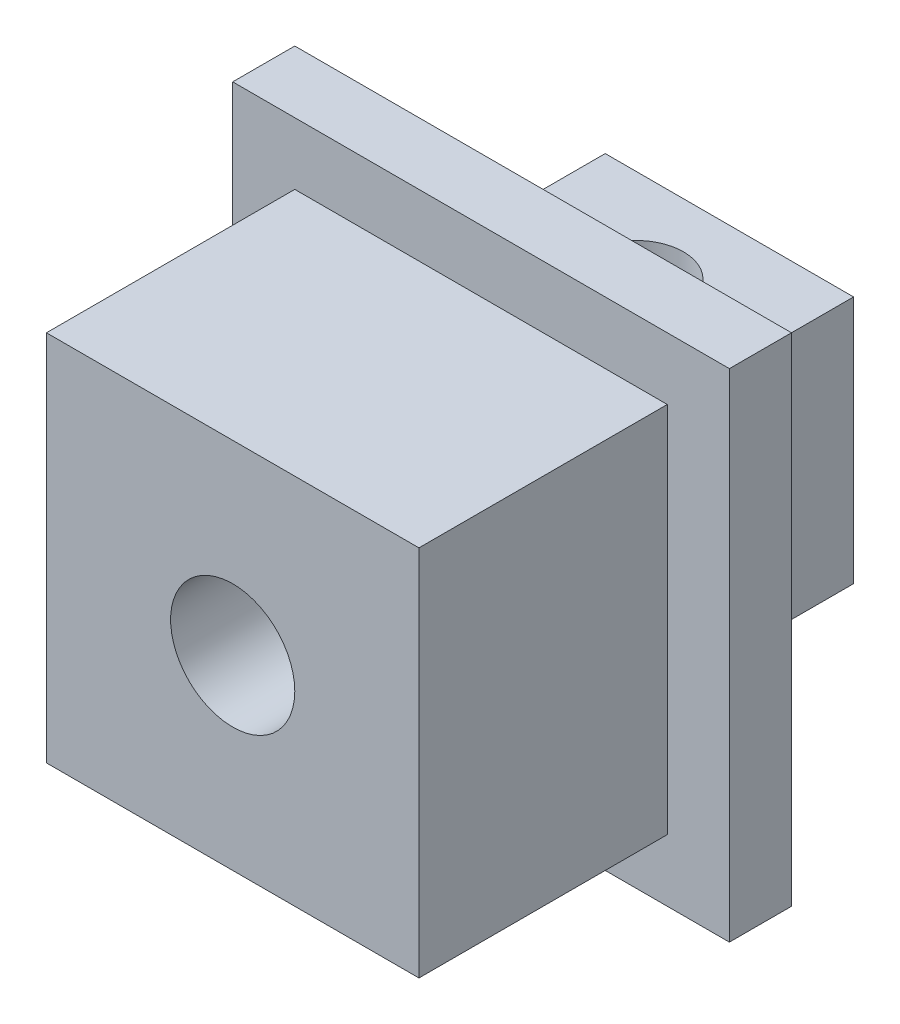
ISO-10303-21;
HEADER;
FILE_DESCRIPTION(('STEP AP214'),'2;1');
FILE_NAME('part.step','',(''),(''),'','','');
FILE_SCHEMA(('AUTOMOTIVE_DESIGN { 1 0 10303 214 1 1 1 1 }'));
ENDSEC;
DATA;
#1=APPLICATION_CONTEXT('core data for automotive mechanical design processes');
#2=APPLICATION_PROTOCOL_DEFINITION('international standard','automotive_design',2000,#1);
#3=PRODUCT_CONTEXT('',#1,'mechanical');
#4=PRODUCT('Part','Part','',(#3));
#5=PRODUCT_RELATED_PRODUCT_CATEGORY('part','',(#4));
#6=PRODUCT_DEFINITION_FORMATION('','',#4);
#7=PRODUCT_DEFINITION_CONTEXT('part definition',#1,'design');
#8=PRODUCT_DEFINITION('design','',#6,#7);
#9=PRODUCT_DEFINITION_SHAPE('','',#8);
#10=(LENGTH_UNIT() NAMED_UNIT(*) SI_UNIT(.MILLI.,.METRE.));
#11=(NAMED_UNIT(*) PLANE_ANGLE_UNIT() SI_UNIT($,.RADIAN.));
#12=(NAMED_UNIT(*) SI_UNIT($,.STERADIAN.) SOLID_ANGLE_UNIT());
#13=UNCERTAINTY_MEASURE_WITH_UNIT(LENGTH_MEASURE(1.E-05),#10,'distance_accuracy_value','');
#14=(GEOMETRIC_REPRESENTATION_CONTEXT(3) GLOBAL_UNCERTAINTY_ASSIGNED_CONTEXT((#13)) GLOBAL_UNIT_ASSIGNED_CONTEXT((#10,
#11,#12)) REPRESENTATION_CONTEXT('',''));
#15=CARTESIAN_POINT('',(0.,0.,0.));
#16=DIRECTION('',(0.,0.,1.));
#17=DIRECTION('',(1.,0.,0.));
#18=AXIS2_PLACEMENT_3D('',#15,#16,#17);
#19=CARTESIAN_POINT('',(0.,0.,-3.175));
#20=DIRECTION('',(0.,0.,-1.));
#21=DIRECTION('',(-1.,0.,0.));
#22=AXIS2_PLACEMENT_3D('',#19,#20,#21);
#23=PLANE('',#22);
#24=DIRECTION('',(0.,1.,0.));
#25=VECTOR('',#24,1.);
#26=CARTESIAN_POINT('',(-3.175,-3.175,-3.175));
#27=LINE('',#26,#25);
#28=CARTESIAN_POINT('',(-3.175,-3.175,-3.175));
#29=VERTEX_POINT('',#28);
#30=CARTESIAN_POINT('',(-3.175,22.225,-3.175));
#31=VERTEX_POINT('',#30);
#32=EDGE_CURVE('E197',#29,#31,#27,.T.);
#33=ORIENTED_EDGE('',*,*,#32,.T.);
#34=DIRECTION('',(1.,0.,0.));
#35=VECTOR('',#34,1.);
#36=CARTESIAN_POINT('',(-3.175,22.225,-3.175));
#37=LINE('',#36,#35);
#38=CARTESIAN_POINT('',(22.225,22.225,-3.175));
#39=VERTEX_POINT('',#38);
#40=EDGE_CURVE('E200',#31,#39,#37,.T.);
#41=ORIENTED_EDGE('',*,*,#40,.T.);
#42=DIRECTION('',(0.,-1.,0.));
#43=VECTOR('',#42,1.);
#44=CARTESIAN_POINT('',(22.225,-3.175,-3.175));
#45=LINE('',#44,#43);
#46=CARTESIAN_POINT('',(22.225,-3.175,-3.175));
#47=VERTEX_POINT('',#46);
#48=EDGE_CURVE('E203',#39,#47,#45,.T.);
#49=ORIENTED_EDGE('',*,*,#48,.T.);
#50=DIRECTION('',(-1.,0.,0.));
#51=VECTOR('',#50,1.);
#52=CARTESIAN_POINT('',(-3.175,-3.175,-3.175));
#53=LINE('',#52,#51);
#54=EDGE_CURVE('E205',#47,#29,#53,.T.);
#55=ORIENTED_EDGE('',*,*,#54,.T.);
#56=EDGE_LOOP('',(#33,#41,#49,#55));
#57=FACE_BOUND('',#56,.T.);
#58=DIRECTION('',(1.,0.,0.));
#59=VECTOR('',#58,1.);
#60=CARTESIAN_POINT('',(3.175,15.875,-3.175));
#61=LINE('',#60,#59);
#62=CARTESIAN_POINT('',(3.175,15.875,-3.175));
#63=VERTEX_POINT('',#62);
#64=CARTESIAN_POINT('',(15.875,15.875,-3.175));
#65=VERTEX_POINT('',#64);
#66=EDGE_CURVE('E410',#63,#65,#61,.T.);
#67=ORIENTED_EDGE('',*,*,#66,.F.);
#68=DIRECTION('',(0.,1.,0.));
#69=VECTOR('',#68,1.);
#70=CARTESIAN_POINT('',(3.175,3.175,-3.175));
#71=LINE('',#70,#69);
#72=CARTESIAN_POINT('',(3.175,3.175,-3.175));
#73=VERTEX_POINT('',#72);
#74=EDGE_CURVE('E187',#73,#63,#71,.T.);
#75=ORIENTED_EDGE('',*,*,#74,.F.);
#76=DIRECTION('',(-1.,0.,0.));
#77=VECTOR('',#76,1.);
#78=CARTESIAN_POINT('',(3.175,3.175,-3.175));
#79=LINE('',#78,#77);
#80=CARTESIAN_POINT('',(15.875,3.175,-3.175));
#81=VERTEX_POINT('',#80);
#82=EDGE_CURVE('E183',#81,#73,#79,.T.);
#83=ORIENTED_EDGE('',*,*,#82,.F.);
#84=DIRECTION('',(0.,-1.,0.));
#85=VECTOR('',#84,1.);
#86=CARTESIAN_POINT('',(15.875,3.175,-3.175));
#87=LINE('',#86,#85);
#88=EDGE_CURVE('E412',#65,#81,#87,.T.);
#89=ORIENTED_EDGE('',*,*,#88,.F.);
#90=EDGE_LOOP('',(#67,#75,#83,#89));
#91=FACE_BOUND('',#90,.T.);
#92=ADVANCED_FACE('F33',(#57,#91),#23,.T.);
#93=CARTESIAN_POINT('',(0.,0.,12.7));
#94=DIRECTION('',(0.,0.,-1.));
#95=DIRECTION('',(-1.,0.,0.));
#96=AXIS2_PLACEMENT_3D('',#93,#94,#95);
#97=PLANE('',#96);
#98=DIRECTION('',(0.,-1.,0.));
#99=VECTOR('',#98,1.);
#100=CARTESIAN_POINT('',(0.,0.,12.7));
#101=LINE('',#100,#99);
#102=CARTESIAN_POINT('',(0.,19.05,12.7));
#103=VERTEX_POINT('',#102);
#104=CARTESIAN_POINT('',(0.,0.,12.7));
#105=VERTEX_POINT('',#104);
#106=EDGE_CURVE('E91',#103,#105,#101,.T.);
#107=ORIENTED_EDGE('',*,*,#106,.T.);
#108=DIRECTION('',(1.,0.,0.));
#109=VECTOR('',#108,1.);
#110=CARTESIAN_POINT('',(0.,0.,12.7));
#111=LINE('',#110,#109);
#112=CARTESIAN_POINT('',(19.05,0.,12.7));
#113=VERTEX_POINT('',#112);
#114=EDGE_CURVE('E83',#105,#113,#111,.T.);
#115=ORIENTED_EDGE('',*,*,#114,.T.);
#116=DIRECTION('',(0.,1.,0.));
#117=VECTOR('',#116,1.);
#118=CARTESIAN_POINT('',(19.05,0.,12.7));
#119=LINE('',#118,#117);
#120=CARTESIAN_POINT('',(19.05,19.05,12.7));
#121=VERTEX_POINT('',#120);
#122=EDGE_CURVE('E88',#113,#121,#119,.T.);
#123=ORIENTED_EDGE('',*,*,#122,.T.);
#124=DIRECTION('',(-1.,0.,0.));
#125=VECTOR('',#124,1.);
#126=CARTESIAN_POINT('',(0.,19.05,12.7));
#127=LINE('',#126,#125);
#128=EDGE_CURVE('E57',#121,#103,#127,.T.);
#129=ORIENTED_EDGE('',*,*,#128,.T.);
#130=EDGE_LOOP('',(#107,#115,#123,#129));
#131=FACE_BOUND('',#130,.T.);
#132=CARTESIAN_POINT('',(9.525,9.525,12.7));
#133=DIRECTION('',(0.,0.,1.));
#134=DIRECTION('',(1.,0.,0.));
#135=AXIS2_PLACEMENT_3D('',#132,#133,#134);
#136=CIRCLE('',#135,3.175);
#137=CARTESIAN_POINT('',(12.7,9.525,12.7));
#138=VERTEX_POINT('',#137);
#139=EDGE_CURVE('E108',#138,#138,#136,.T.);
#140=ORIENTED_EDGE('',*,*,#139,.F.);
#141=EDGE_LOOP('',(#140));
#142=FACE_BOUND('',#141,.T.);
#143=ADVANCED_FACE('F85',(#131,#142),#97,.F.);
#144=CARTESIAN_POINT('',(0.,0.,12.7));
#145=DIRECTION('',(1.,0.,0.));
#146=DIRECTION('',(0.,0.,-1.));
#147=AXIS2_PLACEMENT_3D('',#144,#145,#146);
#148=PLANE('',#147);
#149=DIRECTION('',(0.,-1.,0.));
#150=VECTOR('',#149,1.);
#151=CARTESIAN_POINT('',(0.,0.,0.));
#152=LINE('',#151,#150);
#153=CARTESIAN_POINT('',(0.,19.05,0.));
#154=VERTEX_POINT('',#153);
#155=CARTESIAN_POINT('',(0.,0.,0.));
#156=VERTEX_POINT('',#155);
#157=EDGE_CURVE('E70',#154,#156,#152,.T.);
#158=ORIENTED_EDGE('',*,*,#157,.T.);
#159=DIRECTION('',(0.,0.,-1.));
#160=VECTOR('',#159,1.);
#161=CARTESIAN_POINT('',(0.,0.,12.7));
#162=LINE('',#161,#160);
#163=EDGE_CURVE('E11',#105,#156,#162,.T.);
#164=ORIENTED_EDGE('',*,*,#163,.F.);
#165=ORIENTED_EDGE('',*,*,#106,.F.);
#166=DIRECTION('',(0.,0.,-1.));
#167=VECTOR('',#166,1.);
#168=CARTESIAN_POINT('',(0.,19.05,12.7));
#169=LINE('',#168,#167);
#170=EDGE_CURVE('E103',#103,#154,#169,.T.);
#171=ORIENTED_EDGE('',*,*,#170,.T.);
#172=EDGE_LOOP('',(#158,#164,#165,#171));
#173=FACE_BOUND('',#172,.T.);
#174=ADVANCED_FACE('F35',(#173),#148,.F.);
#175=CARTESIAN_POINT('',(0.,0.,12.7));
#176=DIRECTION('',(0.,1.,0.));
#177=DIRECTION('',(0.,0.,1.));
#178=AXIS2_PLACEMENT_3D('',#175,#176,#177);
#179=PLANE('',#178);
#180=DIRECTION('',(1.,0.,0.));
#181=VECTOR('',#180,1.);
#182=CARTESIAN_POINT('',(0.,0.,0.));
#183=LINE('',#182,#181);
#184=CARTESIAN_POINT('',(19.05,0.,0.));
#185=VERTEX_POINT('',#184);
#186=EDGE_CURVE('E78',#156,#185,#183,.T.);
#187=ORIENTED_EDGE('',*,*,#186,.T.);
#188=DIRECTION('',(0.,0.,-1.));
#189=VECTOR('',#188,1.);
#190=CARTESIAN_POINT('',(19.05,0.,12.7));
#191=LINE('',#190,#189);
#192=EDGE_CURVE('E41',#113,#185,#191,.T.);
#193=ORIENTED_EDGE('',*,*,#192,.F.);
#194=ORIENTED_EDGE('',*,*,#114,.F.);
#195=ORIENTED_EDGE('',*,*,#163,.T.);
#196=EDGE_LOOP('',(#187,#193,#194,#195));
#197=FACE_BOUND('',#196,.T.);
#198=ADVANCED_FACE('F96',(#197),#179,.F.);
#199=CARTESIAN_POINT('',(19.05,0.,12.7));
#200=DIRECTION('',(-1.,0.,0.));
#201=DIRECTION('',(0.,0.,1.));
#202=AXIS2_PLACEMENT_3D('',#199,#200,#201);
#203=PLANE('',#202);
#204=DIRECTION('',(0.,1.,0.));
#205=VECTOR('',#204,1.);
#206=CARTESIAN_POINT('',(19.05,0.,0.));
#207=LINE('',#206,#205);
#208=CARTESIAN_POINT('',(19.05,19.05,0.));
#209=VERTEX_POINT('',#208);
#210=EDGE_CURVE('E110',#185,#209,#207,.T.);
#211=ORIENTED_EDGE('',*,*,#210,.T.);
#212=DIRECTION('',(0.,0.,-1.));
#213=VECTOR('',#212,1.);
#214=CARTESIAN_POINT('',(19.05,19.05,12.7));
#215=LINE('',#214,#213);
#216=EDGE_CURVE('E99',#121,#209,#215,.T.);
#217=ORIENTED_EDGE('',*,*,#216,.F.);
#218=ORIENTED_EDGE('',*,*,#122,.F.);
#219=ORIENTED_EDGE('',*,*,#192,.T.);
#220=EDGE_LOOP('',(#211,#217,#218,#219));
#221=FACE_BOUND('',#220,.T.);
#222=ADVANCED_FACE('F100',(#221),#203,.F.);
#223=CARTESIAN_POINT('',(0.,19.05,12.7));
#224=DIRECTION('',(0.,-1.,0.));
#225=DIRECTION('',(0.,0.,-1.));
#226=AXIS2_PLACEMENT_3D('',#223,#224,#225);
#227=PLANE('',#226);
#228=DIRECTION('',(-1.,0.,0.));
#229=VECTOR('',#228,1.);
#230=CARTESIAN_POINT('',(0.,19.05,0.));
#231=LINE('',#230,#229);
#232=EDGE_CURVE('E112',#209,#154,#231,.T.);
#233=ORIENTED_EDGE('',*,*,#232,.T.);
#234=ORIENTED_EDGE('',*,*,#170,.F.);
#235=ORIENTED_EDGE('',*,*,#128,.F.);
#236=ORIENTED_EDGE('',*,*,#216,.T.);
#237=EDGE_LOOP('',(#233,#234,#235,#236));
#238=FACE_BOUND('',#237,.T.);
#239=ADVANCED_FACE('F117',(#238),#227,.F.);
#240=CARTESIAN_POINT('',(9.525,9.525,12.7));
#241=DIRECTION('',(0.,0.,-1.));
#242=DIRECTION('',(-1.,0.,0.));
#243=AXIS2_PLACEMENT_3D('',#240,#241,#242);
#244=CYLINDRICAL_SURFACE('',#243,3.175);
#245=CARTESIAN_POINT('',(7.112,11.5885057547775,-7.9375));
#246=CARTESIAN_POINT('',(7.11199615123723,11.5884976655522,-7.99349775860787));
#247=CARTESIAN_POINT('',(7.11395363358294,11.5907965927886,-8.04946989843456));
#248=CARTESIAN_POINT('',(7.12170610503208,11.5998105922127,-8.16079693231246));
#249=CARTESIAN_POINT('',(7.12750199521794,11.6065267013499,-8.21615167832444));
#250=CARTESIAN_POINT('',(7.15047356968717,11.6327976643081,-8.38073093090295));
#251=CARTESIAN_POINT('',(7.17323221770261,11.6584726735755,-8.48824231821194));
#252=CARTESIAN_POINT('',(7.23777648353192,11.7276911173498,-8.71738359989282));
#253=CARTESIAN_POINT('',(7.28252449329329,11.7738324095012,-8.83733244934208));
#254=CARTESIAN_POINT('',(7.38834444329943,11.8746141948332,-9.06584090979841));
#255=CARTESIAN_POINT('',(7.44943762836851,11.9292657103533,-9.17438544035832));
#256=CARTESIAN_POINT('',(7.58828889868801,12.0425395071892,-9.38239494143065));
#257=CARTESIAN_POINT('',(7.66640896864011,12.1012253325121,-9.48158236996808));
#258=CARTESIAN_POINT('',(7.83776333700548,12.2165641441437,-9.6671589155479));
#259=CARTESIAN_POINT('',(7.93098474158564,12.2732188147349,-9.75355883145485));
#260=CARTESIAN_POINT('',(8.12783392323318,12.3781520885915,-9.9086748913667));
#261=CARTESIAN_POINT('',(8.23085710505551,12.4266831575787,-9.97798310408557));
#262=CARTESIAN_POINT('',(8.44950782115045,12.5146095401167,-10.1011940617873));
#263=CARTESIAN_POINT('',(8.56513271078108,12.554006765124,-10.155100030576));
#264=CARTESIAN_POINT('',(8.74673115192178,12.6037888502557,-10.2224747928511));
#265=CARTESIAN_POINT('',(8.80896911487493,12.6188842968794,-10.2427552639036));
#266=CARTESIAN_POINT('',(8.93558798593564,12.6454796164445,-10.278328554238));
#267=CARTESIAN_POINT('',(8.99996769538703,12.6569814643422,-10.2936241133089));
#268=CARTESIAN_POINT('',(9.13028494778943,12.6760564017467,-10.3189217509782));
#269=CARTESIAN_POINT('',(9.19622125372996,12.6836325079445,-10.3289278942867));
#270=CARTESIAN_POINT('',(9.32901172878107,12.6946468454028,-10.3434563486708));
#271=CARTESIAN_POINT('',(9.39586572852684,12.6980858300746,-10.3479796582267));
#272=CARTESIAN_POINT('',(9.57618415491754,12.7016010513378,-10.352609365827));
#273=CARTESIAN_POINT('',(9.68992809445181,12.6977103779587,-10.3475023046015));
#274=CARTESIAN_POINT('',(9.91446571992392,12.6780423440986,-10.3215485399462));
#275=CARTESIAN_POINT('',(10.0252593512453,12.6622647637236,-10.3007015453461));
#276=CARTESIAN_POINT('',(10.2375649813794,12.6208378728846,-10.2454166199781));
#277=CARTESIAN_POINT('',(10.3392591164506,12.5955137691396,-10.2114255576762));
#278=CARTESIAN_POINT('',(10.5352265500678,12.536735161841,-10.1314070329983));
#279=CARTESIAN_POINT('',(10.6294985480691,12.5032792375677,-10.0853774672543));
#280=CARTESIAN_POINT('',(10.8213855816043,12.4253616785279,-9.9760553190578));
#281=CARTESIAN_POINT('',(10.9178011033909,12.3800304079376,-9.91128646519787));
#282=CARTESIAN_POINT('',(11.098954618042,12.2843137689123,-9.77010769966705));
#283=CARTESIAN_POINT('',(11.1836787585253,12.2339225252581,-9.69368420093981));
#284=CARTESIAN_POINT('',(11.3570849855719,12.1205501144997,-9.51379067194839));
#285=CARTESIAN_POINT('',(11.4430412027324,12.0570996161344,-9.40798459428229));
#286=CARTESIAN_POINT('',(11.5966654397439,11.933015860265,-9.18225331537667));
#287=CARTESIAN_POINT('',(11.6643368692998,11.8723820792546,-9.06233075254304));
#288=CARTESIAN_POINT('',(11.763525970327,11.7773238651526,-8.84395283025479));
#289=CARTESIAN_POINT('',(11.7998634174135,11.7403044738989,-8.74882901596255));
#290=CARTESIAN_POINT('',(11.8607580705981,11.6760062621728,-8.55180968728378));
#291=CARTESIAN_POINT('',(11.8853433604752,11.6487042606671,-8.44993098566154));
#292=CARTESIAN_POINT('',(11.9183286036818,11.6114164460846,-8.2576341418612));
#293=CARTESIAN_POINT('',(11.9286781723044,11.599369967375,-8.16796359218169));
#294=CARTESIAN_POINT('',(11.9391802952946,11.5871430289763,-7.98724314338598));
#295=CARTESIAN_POINT('',(11.9393412294546,11.5869528179272,-7.89619443940985));
#296=CARTESIAN_POINT('',(11.9294766988836,11.5984424244491,-7.71561406615363));
#297=CARTESIAN_POINT('',(11.919469053996,11.6101014768832,-7.62608002158915));
#298=CARTESIAN_POINT('',(11.8900201824462,11.6434401455903,-7.45046002802574));
#299=CARTESIAN_POINT('',(11.8705633416416,11.6651363447303,-7.36438004240369));
#300=CARTESIAN_POINT('',(11.8120479636136,11.7278649637028,-7.15752304839911));
#301=CARTESIAN_POINT('',(11.7680744615791,11.7731925680586,-7.03945999071252));
#302=CARTESIAN_POINT('',(11.6642688796705,11.8721928223752,-6.81431683897015));
#303=CARTESIAN_POINT('',(11.6044015455166,11.9258839126959,-6.70726190365007));
#304=CARTESIAN_POINT('',(11.4674817833244,12.0380723857768,-6.5003890186222));
#305=CARTESIAN_POINT('',(11.3898563817886,12.0966752317572,-6.40100848059154));
#306=CARTESIAN_POINT('',(11.2195208611782,12.2119684752732,-6.21498712128368));
#307=CARTESIAN_POINT('',(11.1268226655031,12.2686603420456,-6.12833633238393));
#308=CARTESIAN_POINT('',(10.9305609151551,12.3740279242683,-5.97228369857659));
#309=CARTESIAN_POINT('',(10.827540841904,12.4229257133847,-5.90235346223062));
#310=CARTESIAN_POINT('',(10.6089177362038,12.5115721865187,-5.7779961904291));
#311=CARTESIAN_POINT('',(10.4933266199438,12.5513294254894,-5.72355464714892));
#312=CARTESIAN_POINT('',(10.2698207909491,12.6132412990162,-5.63970799587138));
#313=CARTESIAN_POINT('',(10.1633428440056,12.6371391294755,-5.60777643053818));
#314=CARTESIAN_POINT('',(9.94519599744627,12.6740105696952,-5.5587448819583));
#315=CARTESIAN_POINT('',(9.83353042733192,12.6869910868833,-5.54163552043764));
#316=CARTESIAN_POINT('',(9.60782191841651,12.7009378662828,-5.52325851194269));
#317=CARTESIAN_POINT('',(9.49377321755304,12.7018705185681,-5.52203518217749));
#318=CARTESIAN_POINT('',(9.2671946049095,12.6915481497977,-5.53562775241869));
#319=CARTESIAN_POINT('',(9.15466492567642,12.6802912836001,-5.55044608066975));
#320=CARTESIAN_POINT('',(8.93906094474615,12.6472926269228,-5.59424352923147));
#321=CARTESIAN_POINT('',(8.83578802885251,12.6260079173799,-5.62260599276321));
#322=CARTESIAN_POINT('',(8.6358482427002,12.5747048824808,-5.69179712239862));
#323=CARTESIAN_POINT('',(8.53918284528634,12.5446846177199,-5.73262855687234));
#324=CARTESIAN_POINT('',(8.34414373521764,12.4742460311749,-5.83007260480288));
#325=CARTESIAN_POINT('',(8.24665155213737,12.4330679545914,-5.88789019664049));
#326=CARTESIAN_POINT('',(8.06238928822865,12.3449022718193,-6.01502988044388));
#327=CARTESIAN_POINT('',(7.97562771470217,12.29791011448,-6.08436099969117));
#328=CARTESIAN_POINT('',(7.79715604396861,12.1910882085644,-6.24795435900498));
#329=CARTESIAN_POINT('',(7.70789308605918,12.130563933213,-6.34443266485542));
#330=CARTESIAN_POINT('',(7.5459504383585,12.0097892953844,-6.5507230379184));
#331=CARTESIAN_POINT('',(7.47328149747199,11.9495391350887,-6.66054367757918));
#332=CARTESIAN_POINT('',(7.35692431168348,11.8455701398338,-6.87262783019031));
#333=CARTESIAN_POINT('',(7.31038548324284,11.8008094533628,-6.9728106216127));
#334=CARTESIAN_POINT('',(7.23068069631651,11.7204337492915,-7.18178476159065));
#335=CARTESIAN_POINT('',(7.19748510224179,11.6847985285072,-7.29055638355227));
#336=CARTESIAN_POINT('',(7.15240368386846,11.6350406465824,-7.48901515592535));
#337=CARTESIAN_POINT('',(7.13734508955197,11.6178319914642,-7.57719031403109));
#338=CARTESIAN_POINT('',(7.11715399245334,11.5945796751267,-7.75610213823441));
#339=CARTESIAN_POINT('',(7.11200623148925,11.5885188519528,-7.84683464828138));
#340=CARTESIAN_POINT('',(7.112,11.5885057547775,-7.9375));
#341=B_SPLINE_CURVE_WITH_KNOTS('',3,(#245,#246,#247,#248,#249,#250,#251,#252,#253,#254,#255,
#256,#257,#258,#259,#260,#261,#262,#263,#264,#265,#266,#267,#268,#269,#270,#271,#272,#273,#274,
#275,#276,#277,#278,#279,#280,#281,#282,#283,#284,#285,#286,#287,#288,#289,#290,#291,#292,#293,
#294,#295,#296,#297,#298,#299,#300,#301,#302,#303,#304,#305,#306,#307,#308,#309,#310,#311,#312,
#313,#314,#315,#316,#317,#318,#319,#320,#321,#322,#323,#324,#325,#326,#327,#328,#329,#330,#331,
#332,#333,#334,#335,#336,#337,#338,#339,#340),.UNSPECIFIED.,.T.,.F.,(4,2,2,2,2,2,2,2,2,2,2,2,2,
2,2,2,2,2,2,2,2,2,2,2,2,2,2,2,2,2,2,2,2,2,2,2,2,2,2,2,2,2,2,2,2,2,2,4),(0.,0.167865888256095,
0.335771197712653,0.672253113083608,1.07835156891591,1.48498044182399,1.90128606810366,
2.31723809952881,2.71564984217269,3.11397813304134,3.31524451605404,3.51640009249261,
3.71740086315174,3.91836502400479,4.25822516390753,4.5980915909793,4.92729627701077,
5.25655852017195,5.62925585145851,6.00239104485088,6.45173609341997,6.90099729124186,
7.22505308842907,7.54833057917689,7.82029622288301,8.09203818153405,8.36330474814149,
8.63502109706667,9.0344822310289,9.43483692618391,9.85060800682648,10.2660517758864,
10.6657843340455,11.0651412318547,11.4047809397803,11.744205594297,12.0845769378616,
12.4249998110424,12.7512185535045,13.0775097760131,13.437976633863,13.7987274649636,
14.2312195288266,14.6639909531059,15.020469887145,15.3761526405411,15.6483618586289,
15.9201516619829),.UNSPECIFIED.);
#342=CARTESIAN_POINT('',(7.112,11.5885057547775,-7.9375));
#343=VERTEX_POINT('',#342);
#344=EDGE_CURVE('E397',#343,#343,#341,.T.);
#345=ORIENTED_EDGE('',*,*,#344,.F.);
#346=EDGE_LOOP('',(#345));
#347=FACE_BOUND('',#346,.T.);
#348=ORIENTED_EDGE('',*,*,#139,.T.);
#349=EDGE_LOOP('',(#348));
#350=FACE_BOUND('',#349,.T.);
#351=CARTESIAN_POINT('',(9.525,9.525,-12.7));
#352=DIRECTION('',(0.,0.,1.));
#353=DIRECTION('',(1.,0.,0.));
#354=AXIS2_PLACEMENT_3D('',#351,#352,#353);
#355=CIRCLE('',#354,3.175);
#356=CARTESIAN_POINT('',(12.7,9.525,-12.7));
#357=VERTEX_POINT('',#356);
#358=EDGE_CURVE('E402',#357,#357,#355,.T.);
#359=ORIENTED_EDGE('',*,*,#358,.F.);
#360=EDGE_LOOP('',(#359));
#361=FACE_BOUND('',#360,.T.);
#362=ADVANCED_FACE('F226',(#347,#350,#361),#244,.F.);
#363=CARTESIAN_POINT('',(-3.175,-3.175,-3.175));
#364=DIRECTION('',(1.,0.,0.));
#365=DIRECTION('',(0.,1.,0.));
#366=AXIS2_PLACEMENT_3D('',#363,#364,#365);
#367=PLANE('',#366);
#368=DIRECTION('',(0.,1.,0.));
#369=VECTOR('',#368,1.);
#370=CARTESIAN_POINT('',(-3.175,-3.175,0.));
#371=LINE('',#370,#369);
#372=CARTESIAN_POINT('',(-3.175,-3.175,0.));
#373=VERTEX_POINT('',#372);
#374=CARTESIAN_POINT('',(-3.175,22.225,0.));
#375=VERTEX_POINT('',#374);
#376=EDGE_CURVE('E189',#373,#375,#371,.T.);
#377=ORIENTED_EDGE('',*,*,#376,.T.);
#378=DIRECTION('',(0.,0.,1.));
#379=VECTOR('',#378,1.);
#380=CARTESIAN_POINT('',(-3.175,22.225,-3.175));
#381=LINE('',#380,#379);
#382=EDGE_CURVE('E220',#31,#375,#381,.T.);
#383=ORIENTED_EDGE('',*,*,#382,.F.);
#384=ORIENTED_EDGE('',*,*,#32,.F.);
#385=DIRECTION('',(0.,0.,1.));
#386=VECTOR('',#385,1.);
#387=CARTESIAN_POINT('',(-3.175,-3.175,-3.175));
#388=LINE('',#387,#386);
#389=EDGE_CURVE('E206',#29,#373,#388,.T.);
#390=ORIENTED_EDGE('',*,*,#389,.T.);
#391=EDGE_LOOP('',(#377,#383,#384,#390));
#392=FACE_BOUND('',#391,.T.);
#393=ADVANCED_FACE('F264',(#392),#367,.F.);
#394=CARTESIAN_POINT('',(-3.175,22.225,-3.175));
#395=DIRECTION('',(0.,-1.,0.));
#396=DIRECTION('',(1.,0.,0.));
#397=AXIS2_PLACEMENT_3D('',#394,#395,#396);
#398=PLANE('',#397);
#399=DIRECTION('',(1.,0.,0.));
#400=VECTOR('',#399,1.);
#401=CARTESIAN_POINT('',(-3.175,22.225,0.));
#402=LINE('',#401,#400);
#403=CARTESIAN_POINT('',(22.225,22.225,0.));
#404=VERTEX_POINT('',#403);
#405=EDGE_CURVE('E192',#375,#404,#402,.T.);
#406=ORIENTED_EDGE('',*,*,#405,.T.);
#407=DIRECTION('',(0.,0.,1.));
#408=VECTOR('',#407,1.);
#409=CARTESIAN_POINT('',(22.225,22.225,-3.175));
#410=LINE('',#409,#408);
#411=EDGE_CURVE('E217',#39,#404,#410,.T.);
#412=ORIENTED_EDGE('',*,*,#411,.F.);
#413=ORIENTED_EDGE('',*,*,#40,.F.);
#414=ORIENTED_EDGE('',*,*,#382,.T.);
#415=EDGE_LOOP('',(#406,#412,#413,#414));
#416=FACE_BOUND('',#415,.T.);
#417=ADVANCED_FACE('F272',(#416),#398,.F.);
#418=CARTESIAN_POINT('',(22.225,-3.175,-3.175));
#419=DIRECTION('',(-1.,0.,0.));
#420=DIRECTION('',(0.,0.,1.));
#421=AXIS2_PLACEMENT_3D('',#418,#419,#420);
#422=PLANE('',#421);
#423=DIRECTION('',(0.,-1.,0.));
#424=VECTOR('',#423,1.);
#425=CARTESIAN_POINT('',(22.225,-3.175,0.));
#426=LINE('',#425,#424);
#427=CARTESIAN_POINT('',(22.225,-3.175,0.));
#428=VERTEX_POINT('',#427);
#429=EDGE_CURVE('E209',#404,#428,#426,.T.);
#430=ORIENTED_EDGE('',*,*,#429,.T.);
#431=DIRECTION('',(0.,0.,1.));
#432=VECTOR('',#431,1.);
#433=CARTESIAN_POINT('',(22.225,-3.175,-3.175));
#434=LINE('',#433,#432);
#435=EDGE_CURVE('E214',#47,#428,#434,.T.);
#436=ORIENTED_EDGE('',*,*,#435,.F.);
#437=ORIENTED_EDGE('',*,*,#48,.F.);
#438=ORIENTED_EDGE('',*,*,#411,.T.);
#439=EDGE_LOOP('',(#430,#436,#437,#438));
#440=FACE_BOUND('',#439,.T.);
#441=ADVANCED_FACE('F279',(#440),#422,.F.);
#442=CARTESIAN_POINT('',(-3.175,-3.175,-3.175));
#443=DIRECTION('',(0.,1.,0.));
#444=DIRECTION('',(-1.,0.,0.));
#445=AXIS2_PLACEMENT_3D('',#442,#443,#444);
#446=PLANE('',#445);
#447=DIRECTION('',(-1.,0.,0.));
#448=VECTOR('',#447,1.);
#449=CARTESIAN_POINT('',(-3.175,-3.175,0.));
#450=LINE('',#449,#448);
#451=EDGE_CURVE('E201',#428,#373,#450,.T.);
#452=ORIENTED_EDGE('',*,*,#451,.T.);
#453=ORIENTED_EDGE('',*,*,#389,.F.);
#454=ORIENTED_EDGE('',*,*,#54,.F.);
#455=ORIENTED_EDGE('',*,*,#435,.T.);
#456=EDGE_LOOP('',(#452,#453,#454,#455));
#457=FACE_BOUND('',#456,.T.);
#458=ADVANCED_FACE('F287',(#457),#446,.F.);
#459=CARTESIAN_POINT('',(0.,0.,0.));
#460=DIRECTION('',(0.,0.,-1.));
#461=DIRECTION('',(-1.,0.,0.));
#462=AXIS2_PLACEMENT_3D('',#459,#460,#461);
#463=PLANE('',#462);
#464=ORIENTED_EDGE('',*,*,#186,.F.);
#465=ORIENTED_EDGE('',*,*,#157,.F.);
#466=ORIENTED_EDGE('',*,*,#232,.F.);
#467=ORIENTED_EDGE('',*,*,#210,.F.);
#468=EDGE_LOOP('',(#464,#465,#466,#467));
#469=FACE_BOUND('',#468,.T.);
#470=ORIENTED_EDGE('',*,*,#376,.F.);
#471=ORIENTED_EDGE('',*,*,#451,.F.);
#472=ORIENTED_EDGE('',*,*,#429,.F.);
#473=ORIENTED_EDGE('',*,*,#405,.F.);
#474=EDGE_LOOP('',(#470,#471,#472,#473));
#475=FACE_BOUND('',#474,.T.);
#476=ADVANCED_FACE('F295',(#469,#475),#463,.F.);
#477=CARTESIAN_POINT('',(3.175,3.175,-12.7));
#478=DIRECTION('',(1.,0.,0.));
#479=DIRECTION('',(0.,1.,0.));
#480=AXIS2_PLACEMENT_3D('',#477,#478,#479);
#481=PLANE('',#480);
#482=ORIENTED_EDGE('',*,*,#74,.T.);
#483=DIRECTION('',(0.,0.,1.));
#484=VECTOR('',#483,1.);
#485=CARTESIAN_POINT('',(3.175,15.875,-12.7));
#486=LINE('',#485,#484);
#487=CARTESIAN_POINT('',(3.175,15.875,-12.7));
#488=VERTEX_POINT('',#487);
#489=EDGE_CURVE('E168',#488,#63,#486,.T.);
#490=ORIENTED_EDGE('',*,*,#489,.F.);
#491=DIRECTION('',(0.,1.,0.));
#492=VECTOR('',#491,1.);
#493=CARTESIAN_POINT('',(3.175,3.175,-12.7));
#494=LINE('',#493,#492);
#495=CARTESIAN_POINT('',(3.175,3.175,-12.7));
#496=VERTEX_POINT('',#495);
#497=EDGE_CURVE('E175',#496,#488,#494,.T.);
#498=ORIENTED_EDGE('',*,*,#497,.F.);
#499=DIRECTION('',(0.,0.,1.));
#500=VECTOR('',#499,1.);
#501=CARTESIAN_POINT('',(3.175,3.175,-12.7));
#502=LINE('',#501,#500);
#503=EDGE_CURVE('E408',#496,#73,#502,.T.);
#504=ORIENTED_EDGE('',*,*,#503,.T.);
#505=EDGE_LOOP('',(#482,#490,#498,#504));
#506=FACE_BOUND('',#505,.T.);
#507=ADVANCED_FACE('F185',(#506),#481,.F.);
#508=CARTESIAN_POINT('',(3.175,15.875,-12.7));
#509=DIRECTION('',(0.,-1.,0.));
#510=DIRECTION('',(1.,0.,0.));
#511=AXIS2_PLACEMENT_3D('',#508,#509,#510);
#512=PLANE('',#511);
#513=CARTESIAN_POINT('',(9.525,15.875,-7.9375));
#514=DIRECTION('',(0.,1.,0.));
#515=DIRECTION('',(-1.,0.,0.));
#516=AXIS2_PLACEMENT_3D('',#513,#514,#515);
#517=CIRCLE('',#516,2.413);
#518=CARTESIAN_POINT('',(7.112,15.875,-7.9375));
#519=VERTEX_POINT('',#518);
#520=EDGE_CURVE('E403',#519,#519,#517,.T.);
#521=ORIENTED_EDGE('',*,*,#520,.F.);
#522=EDGE_LOOP('',(#521));
#523=FACE_BOUND('',#522,.T.);
#524=ORIENTED_EDGE('',*,*,#66,.T.);
#525=DIRECTION('',(0.,0.,1.));
#526=VECTOR('',#525,1.);
#527=CARTESIAN_POINT('',(15.875,15.875,-12.7));
#528=LINE('',#527,#526);
#529=CARTESIAN_POINT('',(15.875,15.875,-12.7));
#530=VERTEX_POINT('',#529);
#531=EDGE_CURVE('E171',#530,#65,#528,.T.);
#532=ORIENTED_EDGE('',*,*,#531,.F.);
#533=DIRECTION('',(1.,0.,0.));
#534=VECTOR('',#533,1.);
#535=CARTESIAN_POINT('',(3.175,15.875,-12.7));
#536=LINE('',#535,#534);
#537=EDGE_CURVE('E164',#488,#530,#536,.T.);
#538=ORIENTED_EDGE('',*,*,#537,.F.);
#539=ORIENTED_EDGE('',*,*,#489,.T.);
#540=EDGE_LOOP('',(#524,#532,#538,#539));
#541=FACE_BOUND('',#540,.T.);
#542=ADVANCED_FACE('F166',(#523,#541),#512,.F.);
#543=CARTESIAN_POINT('',(15.875,3.175,-12.7));
#544=DIRECTION('',(-1.,0.,0.));
#545=DIRECTION('',(0.,-1.,0.));
#546=AXIS2_PLACEMENT_3D('',#543,#544,#545);
#547=PLANE('',#546);
#548=ORIENTED_EDGE('',*,*,#88,.T.);
#549=DIRECTION('',(0.,0.,1.));
#550=VECTOR('',#549,1.);
#551=CARTESIAN_POINT('',(15.875,3.175,-12.7));
#552=LINE('',#551,#550);
#553=CARTESIAN_POINT('',(15.875,3.175,-12.7));
#554=VERTEX_POINT('',#553);
#555=EDGE_CURVE('E48',#554,#81,#552,.T.);
#556=ORIENTED_EDGE('',*,*,#555,.F.);
#557=DIRECTION('',(0.,-1.,0.));
#558=VECTOR('',#557,1.);
#559=CARTESIAN_POINT('',(15.875,3.175,-12.7));
#560=LINE('',#559,#558);
#561=EDGE_CURVE('E174',#530,#554,#560,.T.);
#562=ORIENTED_EDGE('',*,*,#561,.F.);
#563=ORIENTED_EDGE('',*,*,#531,.T.);
#564=EDGE_LOOP('',(#548,#556,#562,#563));
#565=FACE_BOUND('',#564,.T.);
#566=ADVANCED_FACE('F316',(#565),#547,.F.);
#567=CARTESIAN_POINT('',(3.175,3.175,-12.7));
#568=DIRECTION('',(0.,1.,0.));
#569=DIRECTION('',(-1.,0.,0.));
#570=AXIS2_PLACEMENT_3D('',#567,#568,#569);
#571=PLANE('',#570);
#572=ORIENTED_EDGE('',*,*,#82,.T.);
#573=ORIENTED_EDGE('',*,*,#503,.F.);
#574=DIRECTION('',(-1.,0.,0.));
#575=VECTOR('',#574,1.);
#576=CARTESIAN_POINT('',(3.175,3.175,-12.7));
#577=LINE('',#576,#575);
#578=EDGE_CURVE('E179',#554,#496,#577,.T.);
#579=ORIENTED_EDGE('',*,*,#578,.F.);
#580=ORIENTED_EDGE('',*,*,#555,.T.);
#581=EDGE_LOOP('',(#572,#573,#579,#580));
#582=FACE_BOUND('',#581,.T.);
#583=ADVANCED_FACE('F324',(#582),#571,.F.);
#584=CARTESIAN_POINT('',(0.,0.,-12.7));
#585=DIRECTION('',(0.,0.,-1.));
#586=DIRECTION('',(-1.,0.,0.));
#587=AXIS2_PLACEMENT_3D('',#584,#585,#586);
#588=PLANE('',#587);
#589=ORIENTED_EDGE('',*,*,#358,.T.);
#590=EDGE_LOOP('',(#589));
#591=FACE_BOUND('',#590,.T.);
#592=ORIENTED_EDGE('',*,*,#497,.T.);
#593=ORIENTED_EDGE('',*,*,#537,.T.);
#594=ORIENTED_EDGE('',*,*,#561,.T.);
#595=ORIENTED_EDGE('',*,*,#578,.T.);
#596=EDGE_LOOP('',(#592,#593,#594,#595));
#597=FACE_BOUND('',#596,.T.);
#598=ADVANCED_FACE('F178',(#591,#597),#588,.T.);
#599=CARTESIAN_POINT('',(9.525,9.525,-7.9375));
#600=DIRECTION('',(0.,1.,0.));
#601=DIRECTION('',(-1.,0.,0.));
#602=AXIS2_PLACEMENT_3D('',#599,#600,#601);
#603=CYLINDRICAL_SURFACE('',#602,2.413);
#604=ORIENTED_EDGE('',*,*,#344,.T.);
#605=EDGE_LOOP('',(#604));
#606=FACE_BOUND('',#605,.T.);
#607=ORIENTED_EDGE('',*,*,#520,.T.);
#608=EDGE_LOOP('',(#607));
#609=FACE_BOUND('',#608,.T.);
#610=ADVANCED_FACE('F337',(#606,#609),#603,.F.);
#611=CLOSED_SHELL('',(#92,#143,#174,#198,#222,#239,#362,#393,#417,#441,#458,#476,#507,#542,#566,
#583,#598,#610));
#612=MANIFOLD_SOLID_BREP('B2',#611);
#613=ADVANCED_BREP_SHAPE_REPRESENTATION('',(#18,#612),#14);
#614=SHAPE_DEFINITION_REPRESENTATION(#9,#613);
ENDSEC;
END-ISO-10303-21;
